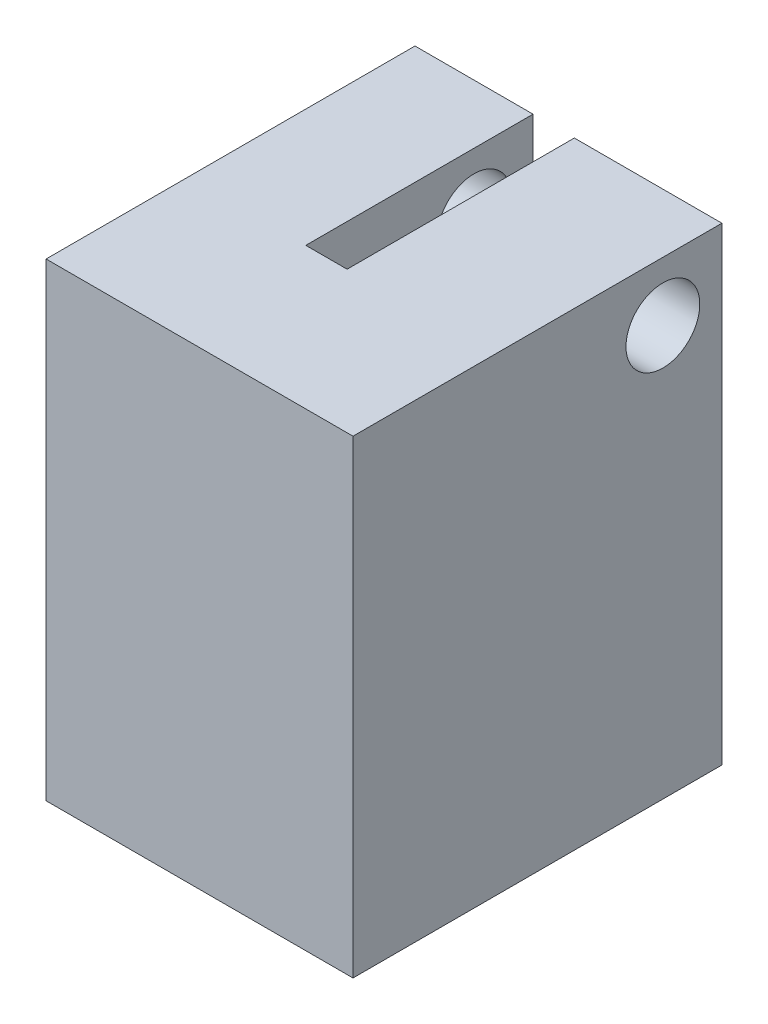
ISO-10303-21;
HEADER;
FILE_DESCRIPTION(('STEP AP214'),'2;1');
FILE_NAME('part.step','',(''),(''),'','','');
FILE_SCHEMA(('AUTOMOTIVE_DESIGN { 1 0 10303 214 1 1 1 1 }'));
ENDSEC;
DATA;
#1=APPLICATION_CONTEXT('core data for automotive mechanical design processes');
#2=APPLICATION_PROTOCOL_DEFINITION('international standard','automotive_design',2000,#1);
#3=PRODUCT_CONTEXT('',#1,'mechanical');
#4=PRODUCT('Part','Part','',(#3));
#5=PRODUCT_RELATED_PRODUCT_CATEGORY('part','',(#4));
#6=PRODUCT_DEFINITION_FORMATION('','',#4);
#7=PRODUCT_DEFINITION_CONTEXT('part definition',#1,'design');
#8=PRODUCT_DEFINITION('design','',#6,#7);
#9=PRODUCT_DEFINITION_SHAPE('','',#8);
#10=(LENGTH_UNIT() NAMED_UNIT(*) SI_UNIT(.MILLI.,.METRE.));
#11=(NAMED_UNIT(*) PLANE_ANGLE_UNIT() SI_UNIT($,.RADIAN.));
#12=(NAMED_UNIT(*) SI_UNIT($,.STERADIAN.) SOLID_ANGLE_UNIT());
#13=UNCERTAINTY_MEASURE_WITH_UNIT(LENGTH_MEASURE(1.E-05),#10,'distance_accuracy_value','');
#14=(GEOMETRIC_REPRESENTATION_CONTEXT(3) GLOBAL_UNCERTAINTY_ASSIGNED_CONTEXT((#13)) GLOBAL_UNIT_ASSIGNED_CONTEXT((#10,
#11,#12)) REPRESENTATION_CONTEXT('',''));
#15=CARTESIAN_POINT('',(0.,0.,0.));
#16=DIRECTION('',(0.,0.,1.));
#17=DIRECTION('',(1.,0.,0.));
#18=AXIS2_PLACEMENT_3D('',#15,#16,#17);
#19=CARTESIAN_POINT('',(13.208,20.193,-15.875));
#20=DIRECTION('',(0.,0.,1.));
#21=DIRECTION('',(0.,-1.,0.));
#22=AXIS2_PLACEMENT_3D('',#19,#20,#21);
#23=PLANE('',#22);
#24=DIRECTION('',(-1.,0.,0.));
#25=VECTOR('',#24,1.);
#26=CARTESIAN_POINT('',(13.208,0.,-15.875));
#27=LINE('',#26,#25);
#28=CARTESIAN_POINT('',(13.208,0.,-15.875));
#29=VERTEX_POINT('',#28);
#30=CARTESIAN_POINT('',(6.858,0.,-15.875));
#31=VERTEX_POINT('',#30);
#32=EDGE_CURVE('E44',#29,#31,#27,.T.);
#33=ORIENTED_EDGE('',*,*,#32,.T.);
#34=DIRECTION('',(0.,-1.,0.));
#35=VECTOR('',#34,1.);
#36=CARTESIAN_POINT('',(6.858,20.193,-15.875));
#37=LINE('',#36,#35);
#38=CARTESIAN_POINT('',(6.858,20.193,-15.875));
#39=VERTEX_POINT('',#38);
#40=EDGE_CURVE('E110',#39,#31,#37,.T.);
#41=ORIENTED_EDGE('',*,*,#40,.F.);
#42=DIRECTION('',(-1.,0.,0.));
#43=VECTOR('',#42,1.);
#44=CARTESIAN_POINT('',(13.208,20.193,-15.875));
#45=LINE('',#44,#43);
#46=CARTESIAN_POINT('',(13.208,20.193,-15.875));
#47=VERTEX_POINT('',#46);
#48=EDGE_CURVE('E133',#47,#39,#45,.T.);
#49=ORIENTED_EDGE('',*,*,#48,.F.);
#50=DIRECTION('',(0.,1.,0.));
#51=VECTOR('',#50,1.);
#52=CARTESIAN_POINT('',(13.208,20.193,-15.875));
#53=LINE('',#52,#51);
#54=EDGE_CURVE('E130',#29,#47,#53,.T.);
#55=ORIENTED_EDGE('',*,*,#54,.F.);
#56=EDGE_LOOP('',(#33,#41,#49,#55));
#57=FACE_BOUND('',#56,.T.);
#58=ADVANCED_FACE('F35',(#57),#23,.F.);
#59=CARTESIAN_POINT('',(13.208,17.653,-13.335));
#60=DIRECTION('',(-1.,0.,0.));
#61=DIRECTION('',(0.,0.,1.));
#62=AXIS2_PLACEMENT_3D('',#59,#60,#61);
#63=CYLINDRICAL_SURFACE('',#62,1.5875);
#64=CARTESIAN_POINT('',(6.858,17.653,-13.335));
#65=DIRECTION('',(1.,0.,0.));
#66=DIRECTION('',(0.,1.,0.));
#67=AXIS2_PLACEMENT_3D('',#64,#65,#66);
#68=CIRCLE('',#67,1.5875);
#69=CARTESIAN_POINT('',(6.858,17.653,-11.7475));
#70=VERTEX_POINT('',#69);
#71=EDGE_CURVE('E39',#70,#70,#68,.T.);
#72=CARTESIAN_POINT('',(13.208,17.653,-13.335));
#73=DIRECTION('',(1.,0.,0.));
#74=DIRECTION('',(0.,0.,-1.));
#75=AXIS2_PLACEMENT_3D('',#72,#73,#74);
#76=CIRCLE('',#75,1.5875);
#77=CARTESIAN_POINT('',(13.208,17.653,-11.7475));
#78=VERTEX_POINT('',#77);
#79=EDGE_CURVE('E148',#78,#78,#76,.T.);
#80=CARTESIAN_POINT('',(6.858,17.653,-11.7475));
#81=CARTESIAN_POINT('',(6.92414583333333,17.653,-11.7475));
#82=CARTESIAN_POINT('',(6.99029166666667,17.653,-11.7475));
#83=CARTESIAN_POINT('',(7.12258333333333,17.653,-11.7475));
#84=CARTESIAN_POINT('',(7.18872916666667,17.653,-11.7475));
#85=CARTESIAN_POINT('',(7.32102083333333,17.653,-11.7475));
#86=CARTESIAN_POINT('',(7.38716666666667,17.653,-11.7475));
#87=CARTESIAN_POINT('',(7.51945833333333,17.653,-11.7475));
#88=CARTESIAN_POINT('',(7.58560416666667,17.653,-11.7475));
#89=CARTESIAN_POINT('',(7.71789583333333,17.653,-11.7475));
#90=CARTESIAN_POINT('',(7.78404166666667,17.653,-11.7475));
#91=CARTESIAN_POINT('',(7.91633333333333,17.653,-11.7475));
#92=CARTESIAN_POINT('',(7.98247916666667,17.653,-11.7475));
#93=CARTESIAN_POINT('',(8.11477083333333,17.653,-11.7475));
#94=CARTESIAN_POINT('',(8.18091666666667,17.653,-11.7475));
#95=CARTESIAN_POINT('',(8.31320833333334,17.653,-11.7475));
#96=CARTESIAN_POINT('',(8.37935416666667,17.653,-11.7475));
#97=CARTESIAN_POINT('',(8.51164583333333,17.653,-11.7475));
#98=CARTESIAN_POINT('',(8.57779166666667,17.653,-11.7475));
#99=CARTESIAN_POINT('',(8.71008333333333,17.653,-11.7475));
#100=CARTESIAN_POINT('',(8.77622916666667,17.653,-11.7475));
#101=CARTESIAN_POINT('',(8.90852083333333,17.653,-11.7475));
#102=CARTESIAN_POINT('',(8.97466666666667,17.653,-11.7475));
#103=CARTESIAN_POINT('',(9.10695833333333,17.653,-11.7475));
#104=CARTESIAN_POINT('',(9.17310416666667,17.653,-11.7475));
#105=CARTESIAN_POINT('',(9.30539583333333,17.653,-11.7475));
#106=CARTESIAN_POINT('',(9.37154166666667,17.653,-11.7475));
#107=CARTESIAN_POINT('',(9.50383333333333,17.653,-11.7475));
#108=CARTESIAN_POINT('',(9.56997916666667,17.653,-11.7475));
#109=CARTESIAN_POINT('',(9.70227083333333,17.653,-11.7475));
#110=CARTESIAN_POINT('',(9.76841666666667,17.653,-11.7475));
#111=CARTESIAN_POINT('',(9.90070833333333,17.653,-11.7475));
#112=CARTESIAN_POINT('',(9.96685416666667,17.653,-11.7475));
#113=CARTESIAN_POINT('',(10.0991458333333,17.653,-11.7475));
#114=CARTESIAN_POINT('',(10.1652916666667,17.653,-11.7475));
#115=CARTESIAN_POINT('',(10.2975833333333,17.653,-11.7475));
#116=CARTESIAN_POINT('',(10.3637291666667,17.653,-11.7475));
#117=CARTESIAN_POINT('',(10.4960208333333,17.653,-11.7475));
#118=CARTESIAN_POINT('',(10.5621666666667,17.653,-11.7475));
#119=CARTESIAN_POINT('',(10.6944583333333,17.653,-11.7475));
#120=CARTESIAN_POINT('',(10.7606041666667,17.653,-11.7475));
#121=CARTESIAN_POINT('',(10.8928958333333,17.653,-11.7475));
#122=CARTESIAN_POINT('',(10.9590416666667,17.653,-11.7475));
#123=CARTESIAN_POINT('',(11.0913333333333,17.653,-11.7475));
#124=CARTESIAN_POINT('',(11.1574791666667,17.653,-11.7475));
#125=CARTESIAN_POINT('',(11.2897708333333,17.653,-11.7475));
#126=CARTESIAN_POINT('',(11.3559166666667,17.653,-11.7475));
#127=CARTESIAN_POINT('',(11.4882083333333,17.653,-11.7475));
#128=CARTESIAN_POINT('',(11.5543541666667,17.653,-11.7475));
#129=CARTESIAN_POINT('',(11.6866458333333,17.653,-11.7475));
#130=CARTESIAN_POINT('',(11.7527916666667,17.653,-11.7475));
#131=CARTESIAN_POINT('',(11.8850833333333,17.653,-11.7475));
#132=CARTESIAN_POINT('',(11.9512291666667,17.653,-11.7475));
#133=CARTESIAN_POINT('',(12.0835208333333,17.653,-11.7475));
#134=CARTESIAN_POINT('',(12.1496666666667,17.653,-11.7475));
#135=CARTESIAN_POINT('',(12.2819583333333,17.653,-11.7475));
#136=CARTESIAN_POINT('',(12.3481041666667,17.653,-11.7475));
#137=CARTESIAN_POINT('',(12.4803958333333,17.653,-11.7475));
#138=CARTESIAN_POINT('',(12.5465416666667,17.653,-11.7475));
#139=CARTESIAN_POINT('',(12.6788333333333,17.653,-11.7475));
#140=CARTESIAN_POINT('',(12.7449791666667,17.653,-11.7475));
#141=CARTESIAN_POINT('',(12.8772708333333,17.653,-11.7475));
#142=CARTESIAN_POINT('',(12.9434166666667,17.653,-11.7475));
#143=CARTESIAN_POINT('',(13.0757083333333,17.653,-11.7475));
#144=CARTESIAN_POINT('',(13.1418541666667,17.653,-11.7475));
#145=CARTESIAN_POINT('',(13.208,17.653,-11.7475));
#146=B_SPLINE_CURVE_WITH_KNOTS('',3,(#80,#81,#82,#83,#84,#85,#86,#87,#88,#89,#90,#91,#92,#93,
#94,#95,#96,#97,#98,#99,#100,#101,#102,#103,#104,#105,#106,#107,#108,#109,#110,#111,#112,#113,
#114,#115,#116,#117,#118,#119,#120,#121,#122,#123,#124,#125,#126,#127,#128,#129,#130,#131,#132,
#133,#134,#135,#136,#137,#138,#139,#140,#141,#142,#143,#144,#145),.UNSPECIFIED.,.F.,.F.,(4,2,2,
2,2,2,2,2,2,2,2,2,2,2,2,2,2,2,2,2,2,2,2,2,2,2,2,2,2,2,2,2,4),(0.,0.1984375,0.396875,
0.595312499999999,0.793749999999999,0.992187499999999,1.190625,1.3890625,1.5875,1.7859375,
1.984375,2.1828125,2.38125,2.5796875,2.778125,2.9765625,3.175,3.3734375,3.571875,3.7703125,
3.96875,4.1671875,4.365625,4.5640625,4.7625,4.9609375,5.159375,5.3578125,5.55625,5.7546875,
5.953125,6.1515625,6.35),.UNSPECIFIED.);
#147=EDGE_CURVE('BSEAM180',#70,#78,#146,.T.);
#148=ORIENTED_EDGE('',*,*,#71,.F.);
#149=ORIENTED_EDGE('',*,*,#79,.T.);
#150=ORIENTED_EDGE('',*,*,#147,.T.);
#151=ORIENTED_EDGE('',*,*,#147,.F.);
#152=EDGE_LOOP('',(#148,#150,#149,#151));
#153=FACE_BOUND('',#152,.T.);
#154=ADVANCED_FACE('F180',(#153),#63,.F.);
#155=CARTESIAN_POINT('',(13.208,0.,0.));
#156=DIRECTION('',(1.,0.,0.));
#157=DIRECTION('',(0.,0.,-1.));
#158=AXIS2_PLACEMENT_3D('',#155,#156,#157);
#159=PLANE('',#158);
#160=DIRECTION('',(0.,-1.,0.));
#161=VECTOR('',#160,1.);
#162=CARTESIAN_POINT('',(13.208,20.193,0.));
#163=LINE('',#162,#161);
#164=CARTESIAN_POINT('',(13.208,20.193,0.));
#165=VERTEX_POINT('',#164);
#166=CARTESIAN_POINT('',(13.208,0.,0.));
#167=VERTEX_POINT('',#166);
#168=EDGE_CURVE('E154',#165,#167,#163,.T.);
#169=ORIENTED_EDGE('',*,*,#168,.T.);
#170=DIRECTION('',(0.,0.,-1.));
#171=VECTOR('',#170,1.);
#172=CARTESIAN_POINT('',(13.208,0.,0.));
#173=LINE('',#172,#171);
#174=EDGE_CURVE('E88',#167,#29,#173,.T.);
#175=ORIENTED_EDGE('',*,*,#174,.T.);
#176=ORIENTED_EDGE('',*,*,#54,.T.);
#177=DIRECTION('',(0.,0.,1.));
#178=VECTOR('',#177,1.);
#179=CARTESIAN_POINT('',(13.208,20.193,0.));
#180=LINE('',#179,#178);
#181=EDGE_CURVE('E61',#47,#165,#180,.T.);
#182=ORIENTED_EDGE('',*,*,#181,.T.);
#183=EDGE_LOOP('',(#169,#175,#176,#182));
#184=FACE_BOUND('',#183,.T.);
#185=ORIENTED_EDGE('',*,*,#79,.F.);
#186=EDGE_LOOP('',(#185));
#187=FACE_BOUND('',#186,.T.);
#188=ADVANCED_FACE('F176',(#184,#187),#159,.T.);
#189=CARTESIAN_POINT('',(0.,0.,0.));
#190=DIRECTION('',(1.,0.,0.));
#191=DIRECTION('',(0.,0.,-1.));
#192=AXIS2_PLACEMENT_3D('',#189,#190,#191);
#193=PLANE('',#192);
#194=DIRECTION('',(0.,-1.,0.));
#195=VECTOR('',#194,1.);
#196=CARTESIAN_POINT('',(0.,20.193,0.));
#197=LINE('',#196,#195);
#198=CARTESIAN_POINT('',(0.,20.193,0.));
#199=VERTEX_POINT('',#198);
#200=CARTESIAN_POINT('',(0.,0.,0.));
#201=VERTEX_POINT('',#200);
#202=EDGE_CURVE('E151',#199,#201,#197,.T.);
#203=ORIENTED_EDGE('',*,*,#202,.F.);
#204=DIRECTION('',(0.,0.,1.));
#205=VECTOR('',#204,1.);
#206=CARTESIAN_POINT('',(0.,20.193,0.));
#207=LINE('',#206,#205);
#208=CARTESIAN_POINT('',(0.,20.193,-15.875));
#209=VERTEX_POINT('',#208);
#210=EDGE_CURVE('E81',#209,#199,#207,.T.);
#211=ORIENTED_EDGE('',*,*,#210,.F.);
#212=DIRECTION('',(0.,1.,0.));
#213=VECTOR('',#212,1.);
#214=CARTESIAN_POINT('',(0.,20.193,-15.875));
#215=LINE('',#214,#213);
#216=CARTESIAN_POINT('',(0.,0.,-15.875));
#217=VERTEX_POINT('',#216);
#218=EDGE_CURVE('E165',#217,#209,#215,.T.);
#219=ORIENTED_EDGE('',*,*,#218,.F.);
#220=DIRECTION('',(0.,0.,-1.));
#221=VECTOR('',#220,1.);
#222=CARTESIAN_POINT('',(0.,0.,0.));
#223=LINE('',#222,#221);
#224=EDGE_CURVE('E162',#201,#217,#223,.T.);
#225=ORIENTED_EDGE('',*,*,#224,.F.);
#226=EDGE_LOOP('',(#203,#211,#219,#225));
#227=FACE_BOUND('',#226,.T.);
#228=CARTESIAN_POINT('',(0.,17.653,-13.335));
#229=DIRECTION('',(1.,0.,0.));
#230=DIRECTION('',(0.,0.,-1.));
#231=AXIS2_PLACEMENT_3D('',#228,#229,#230);
#232=CIRCLE('',#231,1.5875);
#233=CARTESIAN_POINT('',(0.,17.653,-11.7475));
#234=VERTEX_POINT('',#233);
#235=EDGE_CURVE('E141',#234,#234,#232,.T.);
#236=ORIENTED_EDGE('',*,*,#235,.T.);
#237=EDGE_LOOP('',(#236));
#238=FACE_BOUND('',#237,.T.);
#239=ADVANCED_FACE('F179',(#227,#238),#193,.F.);
#240=CARTESIAN_POINT('',(13.208,20.193,0.));
#241=DIRECTION('',(0.,0.,-1.));
#242=DIRECTION('',(0.,1.,0.));
#243=AXIS2_PLACEMENT_3D('',#240,#241,#242);
#244=PLANE('',#243);
#245=ORIENTED_EDGE('',*,*,#202,.T.);
#246=DIRECTION('',(-1.,0.,0.));
#247=VECTOR('',#246,1.);
#248=CARTESIAN_POINT('',(13.208,0.,0.));
#249=LINE('',#248,#247);
#250=EDGE_CURVE('E12',#167,#201,#249,.T.);
#251=ORIENTED_EDGE('',*,*,#250,.F.);
#252=ORIENTED_EDGE('',*,*,#168,.F.);
#253=DIRECTION('',(-1.,0.,0.));
#254=VECTOR('',#253,1.);
#255=CARTESIAN_POINT('',(13.208,20.193,0.));
#256=LINE('',#255,#254);
#257=EDGE_CURVE('E159',#165,#199,#256,.T.);
#258=ORIENTED_EDGE('',*,*,#257,.T.);
#259=EDGE_LOOP('',(#245,#251,#252,#258));
#260=FACE_BOUND('',#259,.T.);
#261=ADVANCED_FACE('F37',(#260),#244,.F.);
#262=CARTESIAN_POINT('',(13.208,0.,0.));
#263=DIRECTION('',(0.,1.,0.));
#264=DIRECTION('',(0.,0.,1.));
#265=AXIS2_PLACEMENT_3D('',#262,#263,#264);
#266=PLANE('',#265);
#267=DIRECTION('',(1.,0.,0.));
#268=VECTOR('',#267,1.);
#269=CARTESIAN_POINT('',(6.858,0.,-6.096));
#270=LINE('',#269,#268);
#271=CARTESIAN_POINT('',(5.08,0.,-6.096));
#272=VERTEX_POINT('',#271);
#273=CARTESIAN_POINT('',(6.858,0.,-6.096));
#274=VERTEX_POINT('',#273);
#275=EDGE_CURVE('E127',#272,#274,#270,.T.);
#276=ORIENTED_EDGE('',*,*,#275,.T.);
#277=DIRECTION('',(0.,0.,-1.));
#278=VECTOR('',#277,1.);
#279=CARTESIAN_POINT('',(6.858,0.,20.271125597756));
#280=LINE('',#279,#278);
#281=EDGE_CURVE('E113',#274,#31,#280,.T.);
#282=ORIENTED_EDGE('',*,*,#281,.T.);
#283=ORIENTED_EDGE('',*,*,#32,.F.);
#284=ORIENTED_EDGE('',*,*,#174,.F.);
#285=ORIENTED_EDGE('',*,*,#250,.T.);
#286=ORIENTED_EDGE('',*,*,#224,.T.);
#287=CARTESIAN_POINT('',(5.08,0.,-15.875));
#288=VERTEX_POINT('',#287);
#289=EDGE_CURVE('E131',#288,#217,#27,.T.);
#290=ORIENTED_EDGE('',*,*,#289,.F.);
#291=DIRECTION('',(0.,0.,-1.));
#292=VECTOR('',#291,1.);
#293=CARTESIAN_POINT('',(5.08,0.,20.271125597756));
#294=LINE('',#293,#292);
#295=EDGE_CURVE('E128',#272,#288,#294,.T.);
#296=ORIENTED_EDGE('',*,*,#295,.F.);
#297=EDGE_LOOP('',(#276,#282,#283,#284,#285,#286,#290,#296));
#298=FACE_BOUND('',#297,.T.);
#299=ADVANCED_FACE('F123',(#298),#266,.F.);
#300=CARTESIAN_POINT('',(5.08,20.193,-15.875));
#301=VERTEX_POINT('',#300);
#302=EDGE_CURVE('E168',#301,#209,#45,.T.);
#303=ORIENTED_EDGE('',*,*,#302,.F.);
#304=DIRECTION('',(0.,1.,0.));
#305=VECTOR('',#304,1.);
#306=CARTESIAN_POINT('',(5.08,20.193,-15.875));
#307=LINE('',#306,#305);
#308=EDGE_CURVE('E121',#288,#301,#307,.T.);
#309=ORIENTED_EDGE('',*,*,#308,.F.);
#310=ORIENTED_EDGE('',*,*,#289,.T.);
#311=ORIENTED_EDGE('',*,*,#218,.T.);
#312=EDGE_LOOP('',(#303,#309,#310,#311));
#313=FACE_BOUND('',#312,.T.);
#314=ADVANCED_FACE('F192',(#313),#23,.F.);
#315=CARTESIAN_POINT('',(13.208,20.193,0.));
#316=DIRECTION('',(0.,-1.,0.));
#317=DIRECTION('',(0.,0.,-1.));
#318=AXIS2_PLACEMENT_3D('',#315,#316,#317);
#319=PLANE('',#318);
#320=ORIENTED_EDGE('',*,*,#48,.T.);
#321=DIRECTION('',(0.,0.,-1.));
#322=VECTOR('',#321,1.);
#323=CARTESIAN_POINT('',(6.858,20.193,20.271125597756));
#324=LINE('',#323,#322);
#325=CARTESIAN_POINT('',(6.858,20.193,-6.096));
#326=VERTEX_POINT('',#325);
#327=EDGE_CURVE('E116',#326,#39,#324,.T.);
#328=ORIENTED_EDGE('',*,*,#327,.F.);
#329=DIRECTION('',(-1.,0.,0.));
#330=VECTOR('',#329,1.);
#331=CARTESIAN_POINT('',(6.858,20.193,-6.096));
#332=LINE('',#331,#330);
#333=CARTESIAN_POINT('',(5.08,20.193,-6.096));
#334=VERTEX_POINT('',#333);
#335=EDGE_CURVE('E144',#326,#334,#332,.T.);
#336=ORIENTED_EDGE('',*,*,#335,.T.);
#337=DIRECTION('',(0.,0.,-1.));
#338=VECTOR('',#337,1.);
#339=CARTESIAN_POINT('',(5.08,20.193,20.271125597756));
#340=LINE('',#339,#338);
#341=EDGE_CURVE('E52',#334,#301,#340,.T.);
#342=ORIENTED_EDGE('',*,*,#341,.T.);
#343=ORIENTED_EDGE('',*,*,#302,.T.);
#344=ORIENTED_EDGE('',*,*,#210,.T.);
#345=ORIENTED_EDGE('',*,*,#257,.F.);
#346=ORIENTED_EDGE('',*,*,#181,.F.);
#347=EDGE_LOOP('',(#320,#328,#336,#342,#343,#344,#345,#346));
#348=FACE_BOUND('',#347,.T.);
#349=ADVANCED_FACE('F173',(#348),#319,.F.);
#350=CARTESIAN_POINT('',(5.08,17.653,-13.335));
#351=DIRECTION('',(-1.,0.,0.));
#352=DIRECTION('',(0.,-1.,0.));
#353=AXIS2_PLACEMENT_3D('',#350,#351,#352);
#354=CIRCLE('',#353,1.5875);
#355=CARTESIAN_POINT('',(5.08,17.653,-11.7475));
#356=VERTEX_POINT('',#355);
#357=EDGE_CURVE('E136',#356,#356,#354,.T.);
#358=CARTESIAN_POINT('',(5.08,17.653,-11.7475));
#359=CARTESIAN_POINT('',(5.02708333333333,17.653,-11.7475));
#360=CARTESIAN_POINT('',(4.97416666666667,17.653,-11.7475));
#361=CARTESIAN_POINT('',(4.86833333333333,17.653,-11.7475));
#362=CARTESIAN_POINT('',(4.81541666666667,17.653,-11.7475));
#363=CARTESIAN_POINT('',(4.70958333333333,17.653,-11.7475));
#364=CARTESIAN_POINT('',(4.65666666666667,17.653,-11.7475));
#365=CARTESIAN_POINT('',(4.55083333333333,17.653,-11.7475));
#366=CARTESIAN_POINT('',(4.49791666666667,17.653,-11.7475));
#367=CARTESIAN_POINT('',(4.39208333333333,17.653,-11.7475));
#368=CARTESIAN_POINT('',(4.33916666666667,17.653,-11.7475));
#369=CARTESIAN_POINT('',(4.23333333333333,17.653,-11.7475));
#370=CARTESIAN_POINT('',(4.18041666666667,17.653,-11.7475));
#371=CARTESIAN_POINT('',(4.07458333333333,17.653,-11.7475));
#372=CARTESIAN_POINT('',(4.02166666666667,17.653,-11.7475));
#373=CARTESIAN_POINT('',(3.91583333333333,17.653,-11.7475));
#374=CARTESIAN_POINT('',(3.86291666666667,17.653,-11.7475));
#375=CARTESIAN_POINT('',(3.75708333333333,17.653,-11.7475));
#376=CARTESIAN_POINT('',(3.70416666666667,17.653,-11.7475));
#377=CARTESIAN_POINT('',(3.59833333333333,17.653,-11.7475));
#378=CARTESIAN_POINT('',(3.54541666666667,17.653,-11.7475));
#379=CARTESIAN_POINT('',(3.43958333333333,17.653,-11.7475));
#380=CARTESIAN_POINT('',(3.38666666666667,17.653,-11.7475));
#381=CARTESIAN_POINT('',(3.28083333333333,17.653,-11.7475));
#382=CARTESIAN_POINT('',(3.22791666666667,17.653,-11.7475));
#383=CARTESIAN_POINT('',(3.12208333333333,17.653,-11.7475));
#384=CARTESIAN_POINT('',(3.06916666666667,17.653,-11.7475));
#385=CARTESIAN_POINT('',(2.96333333333333,17.653,-11.7475));
#386=CARTESIAN_POINT('',(2.91041666666667,17.653,-11.7475));
#387=CARTESIAN_POINT('',(2.80458333333333,17.653,-11.7475));
#388=CARTESIAN_POINT('',(2.75166666666667,17.653,-11.7475));
#389=CARTESIAN_POINT('',(2.64583333333333,17.653,-11.7475));
#390=CARTESIAN_POINT('',(2.59291666666667,17.653,-11.7475));
#391=CARTESIAN_POINT('',(2.48708333333333,17.653,-11.7475));
#392=CARTESIAN_POINT('',(2.43416666666667,17.653,-11.7475));
#393=CARTESIAN_POINT('',(2.32833333333333,17.653,-11.7475));
#394=CARTESIAN_POINT('',(2.27541666666667,17.653,-11.7475));
#395=CARTESIAN_POINT('',(2.16958333333333,17.653,-11.7475));
#396=CARTESIAN_POINT('',(2.11666666666667,17.653,-11.7475));
#397=CARTESIAN_POINT('',(2.01083333333333,17.653,-11.7475));
#398=CARTESIAN_POINT('',(1.95791666666667,17.653,-11.7475));
#399=CARTESIAN_POINT('',(1.85208333333333,17.653,-11.7475));
#400=CARTESIAN_POINT('',(1.79916666666667,17.653,-11.7475));
#401=CARTESIAN_POINT('',(1.69333333333333,17.653,-11.7475));
#402=CARTESIAN_POINT('',(1.64041666666667,17.653,-11.7475));
#403=CARTESIAN_POINT('',(1.53458333333333,17.653,-11.7475));
#404=CARTESIAN_POINT('',(1.48166666666667,17.653,-11.7475));
#405=CARTESIAN_POINT('',(1.37583333333333,17.653,-11.7475));
#406=CARTESIAN_POINT('',(1.32291666666667,17.653,-11.7475));
#407=CARTESIAN_POINT('',(1.21708333333333,17.653,-11.7475));
#408=CARTESIAN_POINT('',(1.16416666666667,17.653,-11.7475));
#409=CARTESIAN_POINT('',(1.05833333333333,17.653,-11.7475));
#410=CARTESIAN_POINT('',(1.00541666666667,17.653,-11.7475));
#411=CARTESIAN_POINT('',(0.899583333333333,17.653,-11.7475));
#412=CARTESIAN_POINT('',(0.846666666666666,17.653,-11.7475));
#413=CARTESIAN_POINT('',(0.740833333333333,17.653,-11.7475));
#414=CARTESIAN_POINT('',(0.687916666666667,17.653,-11.7475));
#415=CARTESIAN_POINT('',(0.582083333333334,17.653,-11.7475));
#416=CARTESIAN_POINT('',(0.529166666666667,17.653,-11.7475));
#417=CARTESIAN_POINT('',(0.423333333333334,17.653,-11.7475));
#418=CARTESIAN_POINT('',(0.370416666666667,17.653,-11.7475));
#419=CARTESIAN_POINT('',(0.264583333333333,17.653,-11.7475));
#420=CARTESIAN_POINT('',(0.211666666666666,17.653,-11.7475));
#421=CARTESIAN_POINT('',(0.105833333333333,17.653,-11.7475));
#422=CARTESIAN_POINT('',(0.0529166666666664,17.653,-11.7475));
#423=CARTESIAN_POINT('',(0.,17.653,-11.7475));
#424=B_SPLINE_CURVE_WITH_KNOTS('',3,(#358,#359,#360,#361,#362,#363,#364,#365,#366,#367,#368,
#369,#370,#371,#372,#373,#374,#375,#376,#377,#378,#379,#380,#381,#382,#383,#384,#385,#386,#387,
#388,#389,#390,#391,#392,#393,#394,#395,#396,#397,#398,#399,#400,#401,#402,#403,#404,#405,#406,
#407,#408,#409,#410,#411,#412,#413,#414,#415,#416,#417,#418,#419,#420,#421,#422,#423),
.UNSPECIFIED.,.F.,.F.,(4,2,2,2,2,2,2,2,2,2,2,2,2,2,2,2,2,2,2,2,2,2,2,2,2,2,2,2,2,2,2,2,4),(0.,
0.158749999999999,0.3175,0.476250000000001,0.635,0.793749999999999,0.9525,1.11125,1.27,1.42875,
1.5875,1.74625,1.905,2.06375,2.2225,2.38125,2.54,2.69875,2.8575,3.01625,3.175,3.33375,3.4925,
3.65125,3.81,3.96875,4.1275,4.28625,4.445,4.60375,4.7625,4.92125,5.08),.UNSPECIFIED.);
#425=EDGE_CURVE('BSEAM187',#356,#234,#424,.T.);
#426=ORIENTED_EDGE('',*,*,#357,.F.);
#427=ORIENTED_EDGE('',*,*,#235,.F.);
#428=ORIENTED_EDGE('',*,*,#425,.T.);
#429=ORIENTED_EDGE('',*,*,#425,.F.);
#430=EDGE_LOOP('',(#426,#428,#427,#429));
#431=FACE_BOUND('',#430,.T.);
#432=ADVANCED_FACE('F187',(#431),#63,.F.);
#433=CARTESIAN_POINT('',(6.858,20.193,20.271125597756));
#434=DIRECTION('',(1.,0.,0.));
#435=DIRECTION('',(0.,1.,0.));
#436=AXIS2_PLACEMENT_3D('',#433,#434,#435);
#437=PLANE('',#436);
#438=ORIENTED_EDGE('',*,*,#71,.T.);
#439=EDGE_LOOP('',(#438));
#440=FACE_BOUND('',#439,.T.);
#441=DIRECTION('',(0.,1.,0.));
#442=VECTOR('',#441,1.);
#443=CARTESIAN_POINT('',(6.858,20.193,-6.096));
#444=LINE('',#443,#442);
#445=EDGE_CURVE('E142',#274,#326,#444,.T.);
#446=ORIENTED_EDGE('',*,*,#445,.T.);
#447=ORIENTED_EDGE('',*,*,#327,.T.);
#448=ORIENTED_EDGE('',*,*,#40,.T.);
#449=ORIENTED_EDGE('',*,*,#281,.F.);
#450=EDGE_LOOP('',(#446,#447,#448,#449));
#451=FACE_BOUND('',#450,.T.);
#452=ADVANCED_FACE('F112',(#440,#451),#437,.F.);
#453=CARTESIAN_POINT('',(5.08,20.193,20.271125597756));
#454=DIRECTION('',(-1.,0.,0.));
#455=DIRECTION('',(0.,-1.,0.));
#456=AXIS2_PLACEMENT_3D('',#453,#454,#455);
#457=PLANE('',#456);
#458=ORIENTED_EDGE('',*,*,#357,.T.);
#459=EDGE_LOOP('',(#458));
#460=FACE_BOUND('',#459,.T.);
#461=DIRECTION('',(0.,-1.,0.));
#462=VECTOR('',#461,1.);
#463=CARTESIAN_POINT('',(5.08,20.193,-6.096));
#464=LINE('',#463,#462);
#465=EDGE_CURVE('E263',#334,#272,#464,.T.);
#466=ORIENTED_EDGE('',*,*,#465,.T.);
#467=ORIENTED_EDGE('',*,*,#295,.T.);
#468=ORIENTED_EDGE('',*,*,#308,.T.);
#469=ORIENTED_EDGE('',*,*,#341,.F.);
#470=EDGE_LOOP('',(#466,#467,#468,#469));
#471=FACE_BOUND('',#470,.T.);
#472=ADVANCED_FACE('F201',(#460,#471),#457,.F.);
#473=CARTESIAN_POINT('',(13.208,20.193,-6.096));
#474=DIRECTION('',(0.,0.,-1.));
#475=DIRECTION('',(0.,1.,0.));
#476=AXIS2_PLACEMENT_3D('',#473,#474,#475);
#477=PLANE('',#476);
#478=ORIENTED_EDGE('',*,*,#445,.F.);
#479=ORIENTED_EDGE('',*,*,#275,.F.);
#480=ORIENTED_EDGE('',*,*,#465,.F.);
#481=ORIENTED_EDGE('',*,*,#335,.F.);
#482=EDGE_LOOP('',(#478,#479,#480,#481));
#483=FACE_BOUND('',#482,.T.);
#484=ADVANCED_FACE('F249',(#483),#477,.T.);
#485=CLOSED_SHELL('',(#58,#154,#188,#239,#261,#299,#314,#349,#432,#452,#472,#484));
#486=MANIFOLD_SOLID_BREP('B2',#485);
#487=ADVANCED_BREP_SHAPE_REPRESENTATION('',(#18,#486),#14);
#488=SHAPE_DEFINITION_REPRESENTATION(#9,#487);
ENDSEC;
END-ISO-10303-21;
